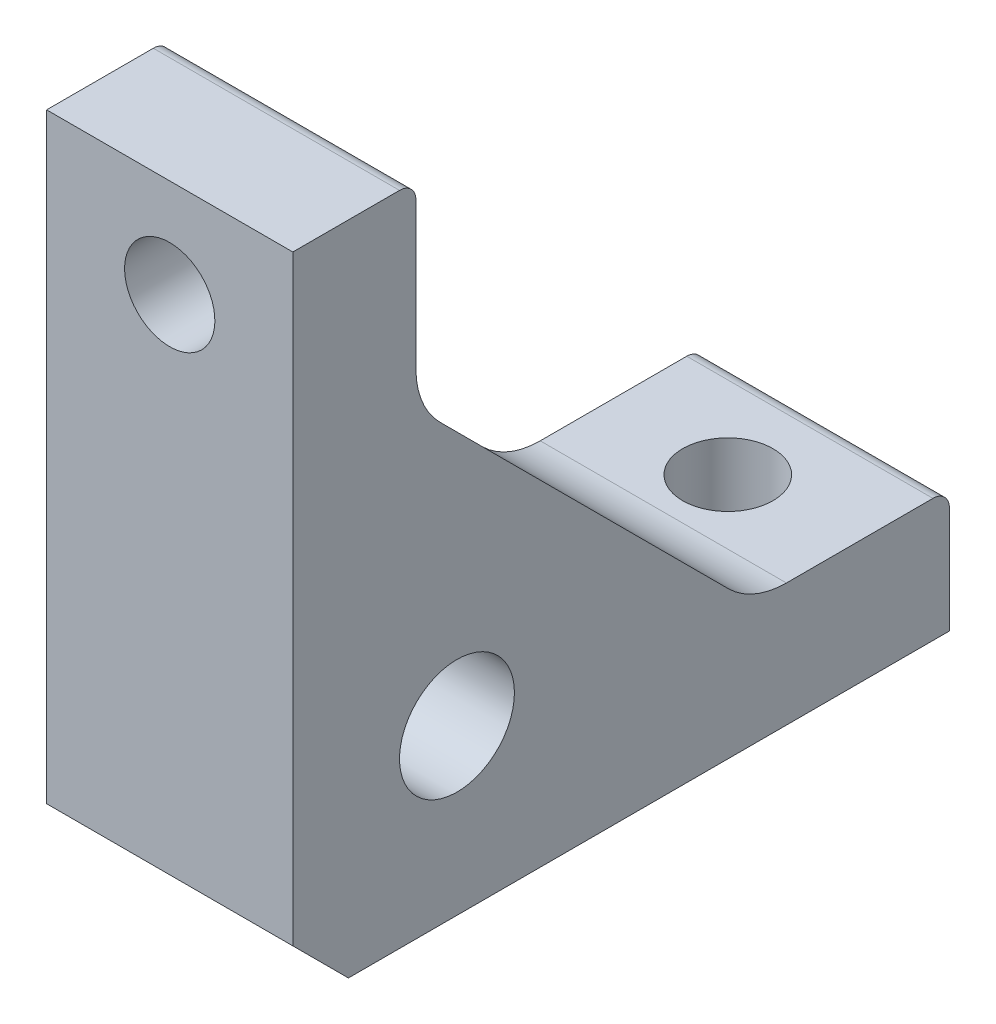
ISO-10303-21;
HEADER;
FILE_DESCRIPTION(('STEP AP214'),'2;1');
FILE_NAME('part.step','',(''),(''),'','','');
FILE_SCHEMA(('AUTOMOTIVE_DESIGN { 1 0 10303 214 1 1 1 1 }'));
ENDSEC;
DATA;
#1=APPLICATION_CONTEXT('core data for automotive mechanical design processes');
#2=APPLICATION_PROTOCOL_DEFINITION('international standard','automotive_design',2000,#1);
#3=PRODUCT_CONTEXT('',#1,'mechanical');
#4=PRODUCT('Part','Part','',(#3));
#5=PRODUCT_RELATED_PRODUCT_CATEGORY('part','',(#4));
#6=PRODUCT_DEFINITION_FORMATION('','',#4);
#7=PRODUCT_DEFINITION_CONTEXT('part definition',#1,'design');
#8=PRODUCT_DEFINITION('design','',#6,#7);
#9=PRODUCT_DEFINITION_SHAPE('','',#8);
#10=(LENGTH_UNIT() NAMED_UNIT(*) SI_UNIT(.MILLI.,.METRE.));
#11=(NAMED_UNIT(*) PLANE_ANGLE_UNIT() SI_UNIT($,.RADIAN.));
#12=(NAMED_UNIT(*) SI_UNIT($,.STERADIAN.) SOLID_ANGLE_UNIT());
#13=UNCERTAINTY_MEASURE_WITH_UNIT(LENGTH_MEASURE(1.E-05),#10,'distance_accuracy_value','');
#14=(GEOMETRIC_REPRESENTATION_CONTEXT(3) GLOBAL_UNCERTAINTY_ASSIGNED_CONTEXT((#13)) GLOBAL_UNIT_ASSIGNED_CONTEXT((#10,
#11,#12)) REPRESENTATION_CONTEXT('',''));
#15=CARTESIAN_POINT('',(0.,0.,0.));
#16=DIRECTION('',(0.,0.,1.));
#17=DIRECTION('',(1.,0.,0.));
#18=AXIS2_PLACEMENT_3D('',#15,#16,#17);
#19=CARTESIAN_POINT('',(15.,0.,0.));
#20=DIRECTION('',(-1.,0.,0.));
#21=DIRECTION('',(0.,0.,1.));
#22=AXIS2_PLACEMENT_3D('',#19,#20,#21);
#23=PLANE('',#22);
#24=DIRECTION('',(0.,1.,0.));
#25=VECTOR('',#24,1.);
#26=CARTESIAN_POINT('',(15.,7.5,-40.));
#27=LINE('',#26,#25);
#28=CARTESIAN_POINT('',(15.,0.,-40.));
#29=VERTEX_POINT('',#28);
#30=CARTESIAN_POINT('',(15.,6.5,-40.));
#31=VERTEX_POINT('',#30);
#32=EDGE_CURVE('E232',#29,#31,#27,.T.);
#33=ORIENTED_EDGE('',*,*,#32,.T.);
#34=CARTESIAN_POINT('',(15.,6.5,-39.));
#35=DIRECTION('',(-1.,0.,0.));
#36=DIRECTION('',(0.,0.,1.));
#37=AXIS2_PLACEMENT_3D('',#34,#35,#36);
#38=CIRCLE('',#37,1.);
#39=CARTESIAN_POINT('',(15.,7.5,-39.));
#40=VERTEX_POINT('',#39);
#41=EDGE_CURVE('E178',#31,#40,#38,.F.);
#42=ORIENTED_EDGE('',*,*,#41,.T.);
#43=DIRECTION('',(0.,0.,1.));
#44=VECTOR('',#43,1.);
#45=CARTESIAN_POINT('',(15.,7.5,-28.));
#46=LINE('',#45,#44);
#47=CARTESIAN_POINT('',(15.,7.5,-30.0710678118655));
#48=VERTEX_POINT('',#47);
#49=EDGE_CURVE('E231',#40,#48,#46,.T.);
#50=ORIENTED_EDGE('',*,*,#49,.T.);
#51=CARTESIAN_POINT('',(15.,12.5,-30.0710678118655));
#52=DIRECTION('',(-1.,0.,0.));
#53=DIRECTION('',(0.,0.,1.));
#54=AXIS2_PLACEMENT_3D('',#51,#52,#53);
#55=CIRCLE('',#54,5.);
#56=CARTESIAN_POINT('',(15.,8.96446609406724,-26.5355339059327));
#57=VERTEX_POINT('',#56);
#58=EDGE_CURVE('E162',#48,#57,#55,.T.);
#59=ORIENTED_EDGE('',*,*,#58,.T.);
#60=DIRECTION('',(0.,0.707106781186543,0.707106781186552));
#61=VECTOR('',#60,1.);
#62=CARTESIAN_POINT('',(15.,27.9999999999998,-7.5));
#63=LINE('',#62,#61);
#64=CARTESIAN_POINT('',(15.,26.5355339059325,-8.96446609406728));
#65=VERTEX_POINT('',#64);
#66=EDGE_CURVE('E237',#57,#65,#63,.T.);
#67=ORIENTED_EDGE('',*,*,#66,.T.);
#68=CARTESIAN_POINT('',(15.,30.0710678118653,-12.5));
#69=DIRECTION('',(-1.,0.,0.));
#70=DIRECTION('',(0.,0.,1.));
#71=AXIS2_PLACEMENT_3D('',#68,#69,#70);
#72=CIRCLE('',#71,5.);
#73=CARTESIAN_POINT('',(15.,30.0710678118653,-7.5));
#74=VERTEX_POINT('',#73);
#75=EDGE_CURVE('E166',#65,#74,#72,.T.);
#76=ORIENTED_EDGE('',*,*,#75,.T.);
#77=DIRECTION('',(0.,1.,0.));
#78=VECTOR('',#77,1.);
#79=CARTESIAN_POINT('',(15.,40.,-7.5));
#80=LINE('',#79,#78);
#81=CARTESIAN_POINT('',(15.,39.,-7.5));
#82=VERTEX_POINT('',#81);
#83=EDGE_CURVE('E195',#74,#82,#80,.T.);
#84=ORIENTED_EDGE('',*,*,#83,.T.);
#85=CARTESIAN_POINT('',(15.,39.,-6.5));
#86=DIRECTION('',(-1.,0.,0.));
#87=DIRECTION('',(0.,0.,1.));
#88=AXIS2_PLACEMENT_3D('',#85,#86,#87);
#89=CIRCLE('',#88,1.);
#90=CARTESIAN_POINT('',(15.,40.,-6.5));
#91=VERTEX_POINT('',#90);
#92=EDGE_CURVE('E52',#82,#91,#89,.F.);
#93=ORIENTED_EDGE('',*,*,#92,.T.);
#94=DIRECTION('',(0.,0.,1.));
#95=VECTOR('',#94,1.);
#96=CARTESIAN_POINT('',(15.,40.,0.));
#97=LINE('',#96,#95);
#98=CARTESIAN_POINT('',(15.,40.,0.));
#99=VERTEX_POINT('',#98);
#100=EDGE_CURVE('E118',#91,#99,#97,.T.);
#101=ORIENTED_EDGE('',*,*,#100,.T.);
#102=DIRECTION('',(0.,-1.,0.));
#103=VECTOR('',#102,1.);
#104=CARTESIAN_POINT('',(15.,3.38652967627596,0.));
#105=LINE('',#104,#103);
#106=CARTESIAN_POINT('',(15.,3.38652967627596,0.));
#107=VERTEX_POINT('',#106);
#108=EDGE_CURVE('E122',#99,#107,#105,.T.);
#109=ORIENTED_EDGE('',*,*,#108,.T.);
#110=DIRECTION('',(0.,-0.707106781186543,-0.707106781186551));
#111=VECTOR('',#110,1.);
#112=CARTESIAN_POINT('',(15.,3.38652967627596,0.));
#113=LINE('',#112,#111);
#114=CARTESIAN_POINT('',(15.,0.,-3.386529676276));
#115=VERTEX_POINT('',#114);
#116=EDGE_CURVE('E137',#107,#115,#113,.T.);
#117=ORIENTED_EDGE('',*,*,#116,.T.);
#118=DIRECTION('',(0.,0.,-1.));
#119=VECTOR('',#118,1.);
#120=CARTESIAN_POINT('',(15.,0.,-40.));
#121=LINE('',#120,#119);
#122=EDGE_CURVE('E219',#115,#29,#121,.T.);
#123=ORIENTED_EDGE('',*,*,#122,.T.);
#124=EDGE_LOOP('',(#33,#42,#50,#59,#67,#76,#84,#93,#101,#109,#117,#123));
#125=FACE_BOUND('',#124,.T.);
#126=CARTESIAN_POINT('',(15.,9.99999999999999,-10.));
#127=DIRECTION('',(1.,0.,0.));
#128=DIRECTION('',(0.,0.,-1.));
#129=AXIS2_PLACEMENT_3D('',#126,#127,#128);
#130=CIRCLE('',#129,3.5);
#131=CARTESIAN_POINT('',(15.,9.99999999999999,-13.5));
#132=VERTEX_POINT('',#131);
#133=EDGE_CURVE('E187',#132,#132,#130,.T.);
#134=ORIENTED_EDGE('',*,*,#133,.F.);
#135=EDGE_LOOP('',(#134));
#136=FACE_BOUND('',#135,.T.);
#137=ADVANCED_FACE('F32',(#125,#136),#23,.F.);
#138=CARTESIAN_POINT('',(0.,0.,0.));
#139=DIRECTION('',(-1.,0.,0.));
#140=DIRECTION('',(0.,0.,1.));
#141=AXIS2_PLACEMENT_3D('',#138,#139,#140);
#142=PLANE('',#141);
#143=DIRECTION('',(0.,0.,1.));
#144=VECTOR('',#143,1.);
#145=CARTESIAN_POINT('',(0.,7.5,-28.));
#146=LINE('',#145,#144);
#147=CARTESIAN_POINT('',(0.,7.5,-39.));
#148=VERTEX_POINT('',#147);
#149=CARTESIAN_POINT('',(0.,7.5,-30.0710678118655));
#150=VERTEX_POINT('',#149);
#151=EDGE_CURVE('E204',#148,#150,#146,.T.);
#152=ORIENTED_EDGE('',*,*,#151,.F.);
#153=CARTESIAN_POINT('',(0.,6.5,-39.));
#154=DIRECTION('',(-1.,0.,0.));
#155=DIRECTION('',(0.,0.,1.));
#156=AXIS2_PLACEMENT_3D('',#153,#154,#155);
#157=CIRCLE('',#156,1.);
#158=CARTESIAN_POINT('',(0.,6.5,-40.));
#159=VERTEX_POINT('',#158);
#160=EDGE_CURVE('E173',#148,#159,#157,.T.);
#161=ORIENTED_EDGE('',*,*,#160,.T.);
#162=DIRECTION('',(0.,1.,0.));
#163=VECTOR('',#162,1.);
#164=CARTESIAN_POINT('',(0.,7.5,-40.));
#165=LINE('',#164,#163);
#166=CARTESIAN_POINT('',(0.,0.,-40.));
#167=VERTEX_POINT('',#166);
#168=EDGE_CURVE('E201',#167,#159,#165,.T.);
#169=ORIENTED_EDGE('',*,*,#168,.F.);
#170=DIRECTION('',(0.,0.,-1.));
#171=VECTOR('',#170,1.);
#172=CARTESIAN_POINT('',(0.,0.,-40.));
#173=LINE('',#172,#171);
#174=CARTESIAN_POINT('',(0.,0.,-3.386529676276));
#175=VERTEX_POINT('',#174);
#176=EDGE_CURVE('E199',#175,#167,#173,.T.);
#177=ORIENTED_EDGE('',*,*,#176,.F.);
#178=DIRECTION('',(0.,-0.707106781186543,-0.707106781186551));
#179=VECTOR('',#178,1.);
#180=CARTESIAN_POINT('',(0.,3.38652967627596,0.));
#181=LINE('',#180,#179);
#182=CARTESIAN_POINT('',(0.,3.38652967627596,0.));
#183=VERTEX_POINT('',#182);
#184=EDGE_CURVE('E189',#183,#175,#181,.T.);
#185=ORIENTED_EDGE('',*,*,#184,.F.);
#186=DIRECTION('',(0.,-1.,0.));
#187=VECTOR('',#186,1.);
#188=CARTESIAN_POINT('',(0.,3.38652967627596,0.));
#189=LINE('',#188,#187);
#190=CARTESIAN_POINT('',(0.,40.,0.));
#191=VERTEX_POINT('',#190);
#192=EDGE_CURVE('E186',#191,#183,#189,.T.);
#193=ORIENTED_EDGE('',*,*,#192,.F.);
#194=DIRECTION('',(0.,0.,1.));
#195=VECTOR('',#194,1.);
#196=CARTESIAN_POINT('',(0.,40.,0.));
#197=LINE('',#196,#195);
#198=CARTESIAN_POINT('',(0.,40.,-6.5));
#199=VERTEX_POINT('',#198);
#200=EDGE_CURVE('E141',#199,#191,#197,.T.);
#201=ORIENTED_EDGE('',*,*,#200,.F.);
#202=CARTESIAN_POINT('',(0.,39.,-6.5));
#203=DIRECTION('',(-1.,0.,0.));
#204=DIRECTION('',(0.,0.,1.));
#205=AXIS2_PLACEMENT_3D('',#202,#203,#204);
#206=CIRCLE('',#205,1.);
#207=CARTESIAN_POINT('',(0.,39.,-7.5));
#208=VERTEX_POINT('',#207);
#209=EDGE_CURVE('E171',#199,#208,#206,.T.);
#210=ORIENTED_EDGE('',*,*,#209,.T.);
#211=DIRECTION('',(0.,1.,0.));
#212=VECTOR('',#211,1.);
#213=CARTESIAN_POINT('',(0.,40.,-7.5));
#214=LINE('',#213,#212);
#215=CARTESIAN_POINT('',(0.,30.0710678118653,-7.5));
#216=VERTEX_POINT('',#215);
#217=EDGE_CURVE('E128',#216,#208,#214,.T.);
#218=ORIENTED_EDGE('',*,*,#217,.F.);
#219=CARTESIAN_POINT('',(0.,30.0710678118653,-12.5));
#220=DIRECTION('',(-1.,0.,0.));
#221=DIRECTION('',(0.,0.,1.));
#222=AXIS2_PLACEMENT_3D('',#219,#220,#221);
#223=CIRCLE('',#222,5.);
#224=CARTESIAN_POINT('',(0.,26.5355339059325,-8.96446609406728));
#225=VERTEX_POINT('',#224);
#226=EDGE_CURVE('E164',#216,#225,#223,.F.);
#227=ORIENTED_EDGE('',*,*,#226,.T.);
#228=DIRECTION('',(0.,0.707106781186543,0.707106781186552));
#229=VECTOR('',#228,1.);
#230=CARTESIAN_POINT('',(0.,27.9999999999998,-7.5));
#231=LINE('',#230,#229);
#232=CARTESIAN_POINT('',(0.,8.96446609406724,-26.5355339059327));
#233=VERTEX_POINT('',#232);
#234=EDGE_CURVE('E206',#233,#225,#231,.T.);
#235=ORIENTED_EDGE('',*,*,#234,.F.);
#236=CARTESIAN_POINT('',(0.,12.5,-30.0710678118655));
#237=DIRECTION('',(-1.,0.,0.));
#238=DIRECTION('',(0.,0.,1.));
#239=AXIS2_PLACEMENT_3D('',#236,#237,#238);
#240=CIRCLE('',#239,5.);
#241=EDGE_CURVE('E159',#233,#150,#240,.F.);
#242=ORIENTED_EDGE('',*,*,#241,.T.);
#243=EDGE_LOOP('',(#152,#161,#169,#177,#185,#193,#201,#210,#218,#227,#235,#242));
#244=FACE_BOUND('',#243,.T.);
#245=CARTESIAN_POINT('',(0.,9.99999999999999,-10.));
#246=DIRECTION('',(1.,0.,0.));
#247=DIRECTION('',(0.,0.,-1.));
#248=AXIS2_PLACEMENT_3D('',#245,#246,#247);
#249=CIRCLE('',#248,3.5);
#250=CARTESIAN_POINT('',(0.,9.99999999999999,-13.5));
#251=VERTEX_POINT('',#250);
#252=EDGE_CURVE('E192',#251,#251,#249,.T.);
#253=ORIENTED_EDGE('',*,*,#252,.T.);
#254=EDGE_LOOP('',(#253));
#255=FACE_BOUND('',#254,.T.);
#256=ADVANCED_FACE('F182',(#244,#255),#142,.T.);
#257=CARTESIAN_POINT('',(15.,40.,0.));
#258=DIRECTION('',(0.,-1.,0.));
#259=DIRECTION('',(0.,0.,-1.));
#260=AXIS2_PLACEMENT_3D('',#257,#258,#259);
#261=PLANE('',#260);
#262=ORIENTED_EDGE('',*,*,#100,.F.);
#263=DIRECTION('',(-1.,0.,0.));
#264=VECTOR('',#263,1.);
#265=CARTESIAN_POINT('',(15.,40.,-6.5));
#266=LINE('',#265,#264);
#267=EDGE_CURVE('E40',#91,#199,#266,.T.);
#268=ORIENTED_EDGE('',*,*,#267,.T.);
#269=ORIENTED_EDGE('',*,*,#200,.T.);
#270=DIRECTION('',(-1.,0.,0.));
#271=VECTOR('',#270,1.);
#272=CARTESIAN_POINT('',(15.,40.,0.));
#273=LINE('',#272,#271);
#274=EDGE_CURVE('E133',#99,#191,#273,.T.);
#275=ORIENTED_EDGE('',*,*,#274,.F.);
#276=EDGE_LOOP('',(#262,#268,#269,#275));
#277=FACE_BOUND('',#276,.T.);
#278=ADVANCED_FACE('F139',(#277),#261,.F.);
#279=CARTESIAN_POINT('',(15.,3.38652967627596,0.));
#280=DIRECTION('',(0.,0.,-1.));
#281=DIRECTION('',(0.,1.,0.));
#282=AXIS2_PLACEMENT_3D('',#279,#280,#281);
#283=PLANE('',#282);
#284=CARTESIAN_POINT('',(7.5,34.,0.));
#285=DIRECTION('',(0.,0.,-1.));
#286=DIRECTION('',(0.,1.,0.));
#287=AXIS2_PLACEMENT_3D('',#284,#285,#286);
#288=CIRCLE('',#287,2.75);
#289=CARTESIAN_POINT('',(7.5,36.75,0.));
#290=VERTEX_POINT('',#289);
#291=EDGE_CURVE('E252',#290,#290,#288,.T.);
#292=ORIENTED_EDGE('',*,*,#291,.T.);
#293=EDGE_LOOP('',(#292));
#294=FACE_BOUND('',#293,.T.);
#295=ORIENTED_EDGE('',*,*,#192,.T.);
#296=DIRECTION('',(-1.,0.,0.));
#297=VECTOR('',#296,1.);
#298=CARTESIAN_POINT('',(15.,3.38652967627596,0.));
#299=LINE('',#298,#297);
#300=EDGE_CURVE('E135',#107,#183,#299,.T.);
#301=ORIENTED_EDGE('',*,*,#300,.F.);
#302=ORIENTED_EDGE('',*,*,#108,.F.);
#303=ORIENTED_EDGE('',*,*,#274,.T.);
#304=EDGE_LOOP('',(#295,#301,#302,#303));
#305=FACE_BOUND('',#304,.T.);
#306=ADVANCED_FACE('F132',(#294,#305),#283,.F.);
#307=CARTESIAN_POINT('',(15.,3.38652967627596,0.));
#308=DIRECTION('',(0.,0.707106781186551,-0.707106781186544));
#309=DIRECTION('',(0.,0.707106781186544,0.707106781186551));
#310=AXIS2_PLACEMENT_3D('',#307,#308,#309);
#311=PLANE('',#310);
#312=ORIENTED_EDGE('',*,*,#184,.T.);
#313=DIRECTION('',(-1.,0.,0.));
#314=VECTOR('',#313,1.);
#315=CARTESIAN_POINT('',(15.,0.,-3.386529676276));
#316=LINE('',#315,#314);
#317=EDGE_CURVE('E147',#115,#175,#316,.T.);
#318=ORIENTED_EDGE('',*,*,#317,.F.);
#319=ORIENTED_EDGE('',*,*,#116,.F.);
#320=ORIENTED_EDGE('',*,*,#300,.T.);
#321=EDGE_LOOP('',(#312,#318,#319,#320));
#322=FACE_BOUND('',#321,.T.);
#323=ADVANCED_FACE('F292',(#322),#311,.F.);
#324=CARTESIAN_POINT('',(15.,0.,-40.));
#325=DIRECTION('',(0.,1.,0.));
#326=DIRECTION('',(0.,0.,1.));
#327=AXIS2_PLACEMENT_3D('',#324,#325,#326);
#328=PLANE('',#327);
#329=CARTESIAN_POINT('',(7.5,0.,-34.));
#330=DIRECTION('',(0.,1.,0.));
#331=DIRECTION('',(0.,0.,1.));
#332=AXIS2_PLACEMENT_3D('',#329,#330,#331);
#333=CIRCLE('',#332,2.75);
#334=CARTESIAN_POINT('',(7.5,0.,-31.25));
#335=VERTEX_POINT('',#334);
#336=EDGE_CURVE('E245',#335,#335,#333,.T.);
#337=ORIENTED_EDGE('',*,*,#336,.T.);
#338=EDGE_LOOP('',(#337));
#339=FACE_BOUND('',#338,.T.);
#340=ORIENTED_EDGE('',*,*,#176,.T.);
#341=DIRECTION('',(-1.,0.,0.));
#342=VECTOR('',#341,1.);
#343=CARTESIAN_POINT('',(15.,0.,-40.));
#344=LINE('',#343,#342);
#345=EDGE_CURVE('E210',#29,#167,#344,.T.);
#346=ORIENTED_EDGE('',*,*,#345,.F.);
#347=ORIENTED_EDGE('',*,*,#122,.F.);
#348=ORIENTED_EDGE('',*,*,#317,.T.);
#349=EDGE_LOOP('',(#340,#346,#347,#348));
#350=FACE_BOUND('',#349,.T.);
#351=ADVANCED_FACE('F217',(#339,#350),#328,.F.);
#352=CARTESIAN_POINT('',(15.,7.5,-40.));
#353=DIRECTION('',(0.,0.,1.));
#354=DIRECTION('',(0.,-1.,0.));
#355=AXIS2_PLACEMENT_3D('',#352,#353,#354);
#356=PLANE('',#355);
#357=ORIENTED_EDGE('',*,*,#168,.T.);
#358=DIRECTION('',(-1.,0.,0.));
#359=VECTOR('',#358,1.);
#360=CARTESIAN_POINT('',(15.,6.5,-40.));
#361=LINE('',#360,#359);
#362=EDGE_CURVE('E175',#159,#31,#361,.F.);
#363=ORIENTED_EDGE('',*,*,#362,.T.);
#364=ORIENTED_EDGE('',*,*,#32,.F.);
#365=ORIENTED_EDGE('',*,*,#345,.T.);
#366=EDGE_LOOP('',(#357,#363,#364,#365));
#367=FACE_BOUND('',#366,.T.);
#368=ADVANCED_FACE('F224',(#367),#356,.F.);
#369=CARTESIAN_POINT('',(15.,7.5,-28.));
#370=DIRECTION('',(0.,-1.,0.));
#371=DIRECTION('',(0.,0.,-1.));
#372=AXIS2_PLACEMENT_3D('',#369,#370,#371);
#373=PLANE('',#372);
#374=CARTESIAN_POINT('',(7.5,7.49999999999999,-34.));
#375=DIRECTION('',(0.,1.,0.));
#376=DIRECTION('',(0.,0.,1.));
#377=AXIS2_PLACEMENT_3D('',#374,#375,#376);
#378=CIRCLE('',#377,2.75);
#379=CARTESIAN_POINT('',(7.5,7.49999999999999,-31.25));
#380=VERTEX_POINT('',#379);
#381=EDGE_CURVE('E249',#380,#380,#378,.T.);
#382=ORIENTED_EDGE('',*,*,#381,.F.);
#383=EDGE_LOOP('',(#382));
#384=FACE_BOUND('',#383,.T.);
#385=ORIENTED_EDGE('',*,*,#49,.F.);
#386=DIRECTION('',(-1.,0.,0.));
#387=VECTOR('',#386,1.);
#388=CARTESIAN_POINT('',(15.,7.5,-39.));
#389=LINE('',#388,#387);
#390=EDGE_CURVE('E168',#40,#148,#389,.T.);
#391=ORIENTED_EDGE('',*,*,#390,.T.);
#392=ORIENTED_EDGE('',*,*,#151,.T.);
#393=DIRECTION('',(-1.,0.,0.));
#394=VECTOR('',#393,1.);
#395=CARTESIAN_POINT('',(15.,7.5,-30.0710678118655));
#396=LINE('',#395,#394);
#397=EDGE_CURVE('E153',#150,#48,#396,.F.);
#398=ORIENTED_EDGE('',*,*,#397,.T.);
#399=EDGE_LOOP('',(#385,#391,#392,#398));
#400=FACE_BOUND('',#399,.T.);
#401=ADVANCED_FACE('F234',(#384,#400),#373,.F.);
#402=CARTESIAN_POINT('',(15.,27.9999999999998,-7.5));
#403=DIRECTION('',(0.,-0.707106781186552,0.707106781186543));
#404=DIRECTION('',(0.,-0.707106781186543,-0.707106781186552));
#405=AXIS2_PLACEMENT_3D('',#402,#403,#404);
#406=PLANE('',#405);
#407=ORIENTED_EDGE('',*,*,#66,.F.);
#408=DIRECTION('',(-1.,0.,0.));
#409=VECTOR('',#408,1.);
#410=CARTESIAN_POINT('',(0.,8.96446609406724,-26.5355339059327));
#411=LINE('',#410,#409);
#412=EDGE_CURVE('E145',#57,#233,#411,.T.);
#413=ORIENTED_EDGE('',*,*,#412,.T.);
#414=ORIENTED_EDGE('',*,*,#234,.T.);
#415=DIRECTION('',(-1.,0.,0.));
#416=VECTOR('',#415,1.);
#417=CARTESIAN_POINT('',(15.,26.5355339059325,-8.96446609406728));
#418=LINE('',#417,#416);
#419=EDGE_CURVE('E143',#225,#65,#418,.F.);
#420=ORIENTED_EDGE('',*,*,#419,.T.);
#421=EDGE_LOOP('',(#407,#413,#414,#420));
#422=FACE_BOUND('',#421,.T.);
#423=ADVANCED_FACE('F265',(#422),#406,.F.);
#424=CARTESIAN_POINT('',(15.,40.,-7.5));
#425=DIRECTION('',(0.,0.,1.));
#426=DIRECTION('',(0.,-1.,0.));
#427=AXIS2_PLACEMENT_3D('',#424,#425,#426);
#428=PLANE('',#427);
#429=CARTESIAN_POINT('',(7.5,34.,-7.5));
#430=DIRECTION('',(0.,0.,-1.));
#431=DIRECTION('',(0.,1.,0.));
#432=AXIS2_PLACEMENT_3D('',#429,#430,#431);
#433=CIRCLE('',#432,2.75);
#434=CARTESIAN_POINT('',(7.5,36.75,-7.5));
#435=VERTEX_POINT('',#434);
#436=EDGE_CURVE('E255',#435,#435,#433,.T.);
#437=ORIENTED_EDGE('',*,*,#436,.F.);
#438=EDGE_LOOP('',(#437));
#439=FACE_BOUND('',#438,.T.);
#440=ORIENTED_EDGE('',*,*,#217,.T.);
#441=DIRECTION('',(-1.,0.,0.));
#442=VECTOR('',#441,1.);
#443=CARTESIAN_POINT('',(15.,39.,-7.5));
#444=LINE('',#443,#442);
#445=EDGE_CURVE('E11',#208,#82,#444,.F.);
#446=ORIENTED_EDGE('',*,*,#445,.T.);
#447=ORIENTED_EDGE('',*,*,#83,.F.);
#448=DIRECTION('',(-1.,0.,0.));
#449=VECTOR('',#448,1.);
#450=CARTESIAN_POINT('',(0.,30.0710678118653,-7.5));
#451=LINE('',#450,#449);
#452=EDGE_CURVE('E156',#74,#216,#451,.T.);
#453=ORIENTED_EDGE('',*,*,#452,.T.);
#454=EDGE_LOOP('',(#440,#446,#447,#453));
#455=FACE_BOUND('',#454,.T.);
#456=ADVANCED_FACE('F262',(#439,#455),#428,.F.);
#457=CARTESIAN_POINT('',(15.,9.99999999999999,-10.));
#458=DIRECTION('',(-1.,0.,0.));
#459=DIRECTION('',(0.,0.,1.));
#460=AXIS2_PLACEMENT_3D('',#457,#458,#459);
#461=CYLINDRICAL_SURFACE('',#460,3.5);
#462=ORIENTED_EDGE('',*,*,#133,.T.);
#463=EDGE_LOOP('',(#462));
#464=FACE_BOUND('',#463,.T.);
#465=ORIENTED_EDGE('',*,*,#252,.F.);
#466=EDGE_LOOP('',(#465));
#467=FACE_BOUND('',#466,.T.);
#468=ADVANCED_FACE('F264',(#464,#467),#461,.F.);
#469=CARTESIAN_POINT('',(7.5,-7.50000000000001,-34.));
#470=DIRECTION('',(0.,1.,0.));
#471=DIRECTION('',(0.,0.,1.));
#472=AXIS2_PLACEMENT_3D('',#469,#470,#471);
#473=CYLINDRICAL_SURFACE('',#472,2.75);
#474=ORIENTED_EDGE('',*,*,#381,.T.);
#475=EDGE_LOOP('',(#474));
#476=FACE_BOUND('',#475,.T.);
#477=ORIENTED_EDGE('',*,*,#336,.F.);
#478=EDGE_LOOP('',(#477));
#479=FACE_BOUND('',#478,.T.);
#480=ADVANCED_FACE('F384',(#476,#479),#473,.F.);
#481=CARTESIAN_POINT('',(7.5,34.,7.5));
#482=DIRECTION('',(0.,0.,-1.));
#483=DIRECTION('',(0.,1.,0.));
#484=AXIS2_PLACEMENT_3D('',#481,#482,#483);
#485=CYLINDRICAL_SURFACE('',#484,2.75);
#486=ORIENTED_EDGE('',*,*,#436,.T.);
#487=EDGE_LOOP('',(#486));
#488=FACE_BOUND('',#487,.T.);
#489=ORIENTED_EDGE('',*,*,#291,.F.);
#490=EDGE_LOOP('',(#489));
#491=FACE_BOUND('',#490,.T.);
#492=ADVANCED_FACE('F259',(#488,#491),#485,.F.);
#493=CARTESIAN_POINT('',(15.,12.5,-30.0710678118655));
#494=DIRECTION('',(1.,0.,0.));
#495=DIRECTION('',(0.,0.,-1.));
#496=AXIS2_PLACEMENT_3D('',#493,#494,#495);
#497=CYLINDRICAL_SURFACE('',#496,5.);
#498=ORIENTED_EDGE('',*,*,#58,.F.);
#499=ORIENTED_EDGE('',*,*,#397,.F.);
#500=ORIENTED_EDGE('',*,*,#241,.F.);
#501=ORIENTED_EDGE('',*,*,#412,.F.);
#502=EDGE_LOOP('',(#498,#499,#500,#501));
#503=FACE_BOUND('',#502,.T.);
#504=ADVANCED_FACE('F301',(#503),#497,.F.);
#505=CARTESIAN_POINT('',(15.,30.0710678118653,-12.5));
#506=DIRECTION('',(1.,0.,0.));
#507=DIRECTION('',(0.,0.,-1.));
#508=AXIS2_PLACEMENT_3D('',#505,#506,#507);
#509=CYLINDRICAL_SURFACE('',#508,5.);
#510=ORIENTED_EDGE('',*,*,#75,.F.);
#511=ORIENTED_EDGE('',*,*,#419,.F.);
#512=ORIENTED_EDGE('',*,*,#226,.F.);
#513=ORIENTED_EDGE('',*,*,#452,.F.);
#514=EDGE_LOOP('',(#510,#511,#512,#513));
#515=FACE_BOUND('',#514,.T.);
#516=ADVANCED_FACE('F272',(#515),#509,.F.);
#517=CARTESIAN_POINT('',(15.,6.5,-39.));
#518=DIRECTION('',(-1.,0.,0.));
#519=DIRECTION('',(0.,0.,1.));
#520=AXIS2_PLACEMENT_3D('',#517,#518,#519);
#521=CYLINDRICAL_SURFACE('',#520,1.);
#522=ORIENTED_EDGE('',*,*,#41,.F.);
#523=ORIENTED_EDGE('',*,*,#362,.F.);
#524=ORIENTED_EDGE('',*,*,#160,.F.);
#525=ORIENTED_EDGE('',*,*,#390,.F.);
#526=EDGE_LOOP('',(#522,#523,#524,#525));
#527=FACE_BOUND('',#526,.T.);
#528=ADVANCED_FACE('F228',(#527),#521,.T.);
#529=CARTESIAN_POINT('',(15.,39.,-6.5));
#530=DIRECTION('',(-1.,0.,0.));
#531=DIRECTION('',(0.,0.,1.));
#532=AXIS2_PLACEMENT_3D('',#529,#530,#531);
#533=CYLINDRICAL_SURFACE('',#532,1.);
#534=ORIENTED_EDGE('',*,*,#92,.F.);
#535=ORIENTED_EDGE('',*,*,#445,.F.);
#536=ORIENTED_EDGE('',*,*,#209,.F.);
#537=ORIENTED_EDGE('',*,*,#267,.F.);
#538=EDGE_LOOP('',(#534,#535,#536,#537));
#539=FACE_BOUND('',#538,.T.);
#540=ADVANCED_FACE('F34',(#539),#533,.T.);
#541=CLOSED_SHELL('',(#137,#256,#278,#306,#323,#351,#368,#401,#423,#456,#468,#480,#492,#504,
#516,#528,#540));
#542=MANIFOLD_SOLID_BREP('B2',#541);
#543=ADVANCED_BREP_SHAPE_REPRESENTATION('',(#18,#542),#14);
#544=SHAPE_DEFINITION_REPRESENTATION(#9,#543);
ENDSEC;
END-ISO-10303-21;
